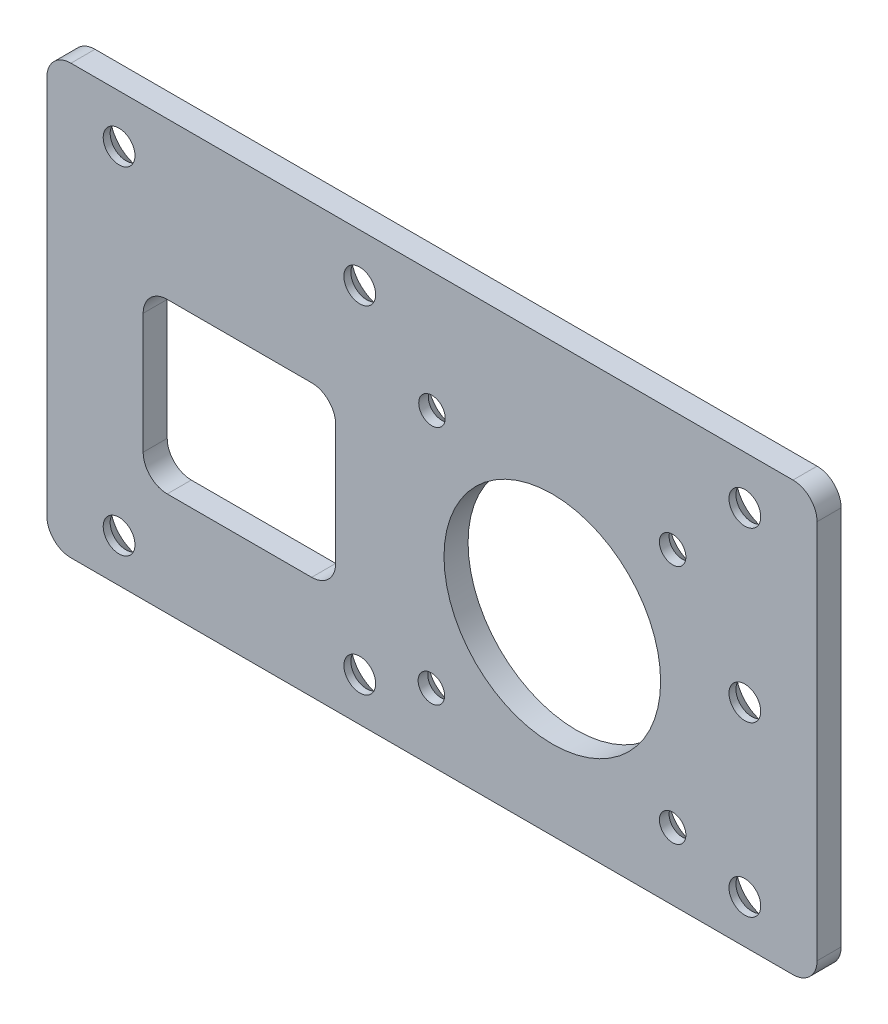
ISO-10303-21;
HEADER;
FILE_DESCRIPTION(('STEP AP214'),'2;1');
FILE_NAME('part.step','',(''),(''),'','','');
FILE_SCHEMA(('AUTOMOTIVE_DESIGN { 1 0 10303 214 1 1 1 1 }'));
ENDSEC;
DATA;
#1=APPLICATION_CONTEXT('core data for automotive mechanical design processes');
#2=APPLICATION_PROTOCOL_DEFINITION('international standard','automotive_design',2000,#1);
#3=PRODUCT_CONTEXT('',#1,'mechanical');
#4=PRODUCT('Part','Part','',(#3));
#5=PRODUCT_RELATED_PRODUCT_CATEGORY('part','',(#4));
#6=PRODUCT_DEFINITION_FORMATION('','',#4);
#7=PRODUCT_DEFINITION_CONTEXT('part definition',#1,'design');
#8=PRODUCT_DEFINITION('design','',#6,#7);
#9=PRODUCT_DEFINITION_SHAPE('','',#8);
#10=(LENGTH_UNIT() NAMED_UNIT(*) SI_UNIT(.MILLI.,.METRE.));
#11=(NAMED_UNIT(*) PLANE_ANGLE_UNIT() SI_UNIT($,.RADIAN.));
#12=(NAMED_UNIT(*) SI_UNIT($,.STERADIAN.) SOLID_ANGLE_UNIT());
#13=UNCERTAINTY_MEASURE_WITH_UNIT(LENGTH_MEASURE(1.E-05),#10,'distance_accuracy_value','');
#14=(GEOMETRIC_REPRESENTATION_CONTEXT(3) GLOBAL_UNCERTAINTY_ASSIGNED_CONTEXT((#13)) GLOBAL_UNIT_ASSIGNED_CONTEXT((#10,
#11,#12)) REPRESENTATION_CONTEXT('',''));
#15=CARTESIAN_POINT('',(0.,0.,0.));
#16=DIRECTION('',(0.,0.,1.));
#17=DIRECTION('',(1.,0.,0.));
#18=AXIS2_PLACEMENT_3D('',#15,#16,#17);
#19=CARTESIAN_POINT('',(55.,-39.,5.));
#20=DIRECTION('',(-1.,0.,0.));
#21=DIRECTION('',(0.,-1.,0.));
#22=AXIS2_PLACEMENT_3D('',#19,#20,#21);
#23=PLANE('',#22);
#24=DIRECTION('',(0.,1.,0.));
#25=VECTOR('',#24,1.);
#26=CARTESIAN_POINT('',(55.,-39.,5.));
#27=LINE('',#26,#25);
#28=CARTESIAN_POINT('',(55.,-34.,5.));
#29=VERTEX_POINT('',#28);
#30=CARTESIAN_POINT('',(55.,45.,5.));
#31=VERTEX_POINT('',#30);
#32=EDGE_CURVE('E312',#29,#31,#27,.T.);
#33=ORIENTED_EDGE('',*,*,#32,.F.);
#34=DIRECTION('',(0.,0.,-1.));
#35=VECTOR('',#34,1.);
#36=CARTESIAN_POINT('',(55.,-34.,5.));
#37=LINE('',#36,#35);
#38=CARTESIAN_POINT('',(55.,-34.,0.));
#39=VERTEX_POINT('',#38);
#40=EDGE_CURVE('E172',#29,#39,#37,.T.);
#41=ORIENTED_EDGE('',*,*,#40,.T.);
#42=DIRECTION('',(0.,1.,0.));
#43=VECTOR('',#42,1.);
#44=CARTESIAN_POINT('',(55.,-39.,0.));
#45=LINE('',#44,#43);
#46=CARTESIAN_POINT('',(55.,45.,0.));
#47=VERTEX_POINT('',#46);
#48=EDGE_CURVE('E323',#39,#47,#45,.T.);
#49=ORIENTED_EDGE('',*,*,#48,.T.);
#50=DIRECTION('',(0.,0.,-1.));
#51=VECTOR('',#50,1.);
#52=CARTESIAN_POINT('',(55.,45.,5.));
#53=LINE('',#52,#51);
#54=EDGE_CURVE('E378',#47,#31,#53,.F.);
#55=ORIENTED_EDGE('',*,*,#54,.T.);
#56=EDGE_LOOP('',(#33,#41,#49,#55));
#57=FACE_BOUND('',#56,.T.);
#58=ADVANCED_FACE('F47',(#57),#23,.F.);
#59=CARTESIAN_POINT('',(-105.,50.0000000000005,5.));
#60=DIRECTION('',(0.,-1.,0.));
#61=DIRECTION('',(1.,0.,0.));
#62=AXIS2_PLACEMENT_3D('',#59,#60,#61);
#63=PLANE('',#62);
#64=DIRECTION('',(-1.,0.,0.));
#65=VECTOR('',#64,1.);
#66=CARTESIAN_POINT('',(-105.,50.0000000000005,0.));
#67=LINE('',#66,#65);
#68=CARTESIAN_POINT('',(50.,50.,0.));
#69=VERTEX_POINT('',#68);
#70=CARTESIAN_POINT('',(-100.,50.0000000000005,0.));
#71=VERTEX_POINT('',#70);
#72=EDGE_CURVE('E326',#69,#71,#67,.T.);
#73=ORIENTED_EDGE('',*,*,#72,.T.);
#74=DIRECTION('',(0.,0.,-1.));
#75=VECTOR('',#74,1.);
#76=CARTESIAN_POINT('',(-100.,50.0000000000005,5.));
#77=LINE('',#76,#75);
#78=CARTESIAN_POINT('',(-100.,50.0000000000005,5.));
#79=VERTEX_POINT('',#78);
#80=EDGE_CURVE('E62',#71,#79,#77,.F.);
#81=ORIENTED_EDGE('',*,*,#80,.T.);
#82=DIRECTION('',(-1.,0.,0.));
#83=VECTOR('',#82,1.);
#84=CARTESIAN_POINT('',(-105.,50.0000000000005,5.));
#85=LINE('',#84,#83);
#86=CARTESIAN_POINT('',(50.,50.,5.));
#87=VERTEX_POINT('',#86);
#88=EDGE_CURVE('E314',#87,#79,#85,.T.);
#89=ORIENTED_EDGE('',*,*,#88,.F.);
#90=DIRECTION('',(0.,0.,-1.));
#91=VECTOR('',#90,1.);
#92=CARTESIAN_POINT('',(50.,50.,5.));
#93=LINE('',#92,#91);
#94=EDGE_CURVE('E374',#87,#69,#93,.T.);
#95=ORIENTED_EDGE('',*,*,#94,.T.);
#96=EDGE_LOOP('',(#73,#81,#89,#95));
#97=FACE_BOUND('',#96,.T.);
#98=ADVANCED_FACE('F424',(#97),#63,.F.);
#99=CARTESIAN_POINT('',(-105.,-39.,5.));
#100=DIRECTION('',(1.,0.,0.));
#101=DIRECTION('',(0.,0.,-1.));
#102=AXIS2_PLACEMENT_3D('',#99,#100,#101);
#103=PLANE('',#102);
#104=DIRECTION('',(0.,-1.,0.));
#105=VECTOR('',#104,1.);
#106=CARTESIAN_POINT('',(-105.,-39.,0.));
#107=LINE('',#106,#105);
#108=CARTESIAN_POINT('',(-105.,45.0000000000005,0.));
#109=VERTEX_POINT('',#108);
#110=CARTESIAN_POINT('',(-105.,-34.,0.));
#111=VERTEX_POINT('',#110);
#112=EDGE_CURVE('E328',#109,#111,#107,.T.);
#113=ORIENTED_EDGE('',*,*,#112,.T.);
#114=DIRECTION('',(0.,0.,-1.));
#115=VECTOR('',#114,1.);
#116=CARTESIAN_POINT('',(-105.,-34.,5.));
#117=LINE('',#116,#115);
#118=CARTESIAN_POINT('',(-105.,-34.,5.));
#119=VERTEX_POINT('',#118);
#120=EDGE_CURVE('E365',#111,#119,#117,.F.);
#121=ORIENTED_EDGE('',*,*,#120,.T.);
#122=DIRECTION('',(0.,-1.,0.));
#123=VECTOR('',#122,1.);
#124=CARTESIAN_POINT('',(-105.,-39.,5.));
#125=LINE('',#124,#123);
#126=CARTESIAN_POINT('',(-105.,45.0000000000005,5.));
#127=VERTEX_POINT('',#126);
#128=EDGE_CURVE('E317',#127,#119,#125,.T.);
#129=ORIENTED_EDGE('',*,*,#128,.F.);
#130=DIRECTION('',(0.,0.,-1.));
#131=VECTOR('',#130,1.);
#132=CARTESIAN_POINT('',(-105.,45.0000000000005,5.));
#133=LINE('',#132,#131);
#134=EDGE_CURVE('E362',#127,#109,#133,.T.);
#135=ORIENTED_EDGE('',*,*,#134,.T.);
#136=EDGE_LOOP('',(#113,#121,#129,#135));
#137=FACE_BOUND('',#136,.T.);
#138=ADVANCED_FACE('F430',(#137),#103,.F.);
#139=CARTESIAN_POINT('',(-105.,-39.,5.));
#140=DIRECTION('',(0.,1.,0.));
#141=DIRECTION('',(0.,0.,1.));
#142=AXIS2_PLACEMENT_3D('',#139,#140,#141);
#143=PLANE('',#142);
#144=DIRECTION('',(1.,0.,0.));
#145=VECTOR('',#144,1.);
#146=CARTESIAN_POINT('',(-105.,-39.,5.));
#147=LINE('',#146,#145);
#148=CARTESIAN_POINT('',(-100.,-39.,5.));
#149=VERTEX_POINT('',#148);
#150=CARTESIAN_POINT('',(50.,-39.,5.));
#151=VERTEX_POINT('',#150);
#152=EDGE_CURVE('E320',#149,#151,#147,.T.);
#153=ORIENTED_EDGE('',*,*,#152,.F.);
#154=DIRECTION('',(0.,0.,-1.));
#155=VECTOR('',#154,1.);
#156=CARTESIAN_POINT('',(-100.,-39.,5.));
#157=LINE('',#156,#155);
#158=CARTESIAN_POINT('',(-100.,-39.,0.));
#159=VERTEX_POINT('',#158);
#160=EDGE_CURVE('E351',#149,#159,#157,.T.);
#161=ORIENTED_EDGE('',*,*,#160,.T.);
#162=DIRECTION('',(1.,0.,0.));
#163=VECTOR('',#162,1.);
#164=CARTESIAN_POINT('',(-105.,-39.,0.));
#165=LINE('',#164,#163);
#166=CARTESIAN_POINT('',(50.,-39.,0.));
#167=VERTEX_POINT('',#166);
#168=EDGE_CURVE('E315',#159,#167,#165,.T.);
#169=ORIENTED_EDGE('',*,*,#168,.T.);
#170=DIRECTION('',(0.,0.,-1.));
#171=VECTOR('',#170,1.);
#172=CARTESIAN_POINT('',(50.,-39.,5.));
#173=LINE('',#172,#171);
#174=EDGE_CURVE('E349',#167,#151,#173,.F.);
#175=ORIENTED_EDGE('',*,*,#174,.T.);
#176=EDGE_LOOP('',(#153,#161,#169,#175));
#177=FACE_BOUND('',#176,.T.);
#178=ADVANCED_FACE('F475',(#177),#143,.F.);
#179=CARTESIAN_POINT('',(0.,0.,5.));
#180=DIRECTION('',(0.,0.,-1.));
#181=DIRECTION('',(-1.,0.,0.));
#182=AXIS2_PLACEMENT_3D('',#179,#180,#181);
#183=PLANE('',#182);
#184=DIRECTION('',(0.,1.,0.));
#185=VECTOR('',#184,1.);
#186=CARTESIAN_POINT('',(-85.,0.,5.));
#187=LINE('',#186,#185);
#188=CARTESIAN_POINT('',(-85.,-12.5,5.));
#189=VERTEX_POINT('',#188);
#190=CARTESIAN_POINT('',(-85.,12.5,5.));
#191=VERTEX_POINT('',#190);
#192=EDGE_CURVE('E181',#189,#191,#187,.T.);
#193=ORIENTED_EDGE('',*,*,#192,.T.);
#194=CARTESIAN_POINT('',(-80.,12.5,5.));
#195=DIRECTION('',(0.,0.,-1.));
#196=DIRECTION('',(-1.,0.,0.));
#197=AXIS2_PLACEMENT_3D('',#194,#195,#196);
#198=CIRCLE('',#197,5.);
#199=CARTESIAN_POINT('',(-80.,17.5,5.));
#200=VERTEX_POINT('',#199);
#201=EDGE_CURVE('E384',#191,#200,#198,.T.);
#202=ORIENTED_EDGE('',*,*,#201,.T.);
#203=DIRECTION('',(1.,0.,0.));
#204=VECTOR('',#203,1.);
#205=CARTESIAN_POINT('',(0.,17.5,5.));
#206=LINE('',#205,#204);
#207=CARTESIAN_POINT('',(-50.,17.5,5.));
#208=VERTEX_POINT('',#207);
#209=EDGE_CURVE('E203',#200,#208,#206,.T.);
#210=ORIENTED_EDGE('',*,*,#209,.T.);
#211=CARTESIAN_POINT('',(-50.,12.5,5.));
#212=DIRECTION('',(0.,0.,-1.));
#213=DIRECTION('',(-1.,0.,0.));
#214=AXIS2_PLACEMENT_3D('',#211,#212,#213);
#215=CIRCLE('',#214,5.);
#216=CARTESIAN_POINT('',(-45.,12.5,5.));
#217=VERTEX_POINT('',#216);
#218=EDGE_CURVE('E11',#208,#217,#215,.T.);
#219=ORIENTED_EDGE('',*,*,#218,.T.);
#220=DIRECTION('',(0.,-1.,0.));
#221=VECTOR('',#220,1.);
#222=CARTESIAN_POINT('',(-45.,0.,5.));
#223=LINE('',#222,#221);
#224=CARTESIAN_POINT('',(-45.,-12.5,5.));
#225=VERTEX_POINT('',#224);
#226=EDGE_CURVE('E206',#217,#225,#223,.T.);
#227=ORIENTED_EDGE('',*,*,#226,.T.);
#228=CARTESIAN_POINT('',(-50.,-12.5,5.));
#229=DIRECTION('',(0.,0.,-1.));
#230=DIRECTION('',(-1.,0.,0.));
#231=AXIS2_PLACEMENT_3D('',#228,#229,#230);
#232=CIRCLE('',#231,5.);
#233=CARTESIAN_POINT('',(-50.,-17.5,5.));
#234=VERTEX_POINT('',#233);
#235=EDGE_CURVE('E388',#225,#234,#232,.T.);
#236=ORIENTED_EDGE('',*,*,#235,.T.);
#237=DIRECTION('',(-1.,0.,0.));
#238=VECTOR('',#237,1.);
#239=CARTESIAN_POINT('',(0.,-17.5,5.));
#240=LINE('',#239,#238);
#241=CARTESIAN_POINT('',(-80.,-17.5,5.));
#242=VERTEX_POINT('',#241);
#243=EDGE_CURVE('E194',#234,#242,#240,.T.);
#244=ORIENTED_EDGE('',*,*,#243,.T.);
#245=CARTESIAN_POINT('',(-80.,-12.5,5.));
#246=DIRECTION('',(0.,0.,-1.));
#247=DIRECTION('',(-1.,0.,0.));
#248=AXIS2_PLACEMENT_3D('',#245,#246,#247);
#249=CIRCLE('',#248,5.);
#250=EDGE_CURVE('E171',#242,#189,#249,.T.);
#251=ORIENTED_EDGE('',*,*,#250,.T.);
#252=EDGE_LOOP('',(#193,#202,#210,#219,#227,#236,#244,#251));
#253=FACE_BOUND('',#252,.T.);
#254=CARTESIAN_POINT('',(25.,25.,5.));
#255=DIRECTION('',(0.,0.,-1.));
#256=DIRECTION('',(-1.,0.,0.));
#257=AXIS2_PLACEMENT_3D('',#254,#255,#256);
#258=CIRCLE('',#257,2.75);
#259=CARTESIAN_POINT('',(22.25,25.,5.));
#260=VERTEX_POINT('',#259);
#261=EDGE_CURVE('E215',#260,#260,#258,.T.);
#262=ORIENTED_EDGE('',*,*,#261,.T.);
#263=EDGE_LOOP('',(#262));
#264=FACE_BOUND('',#263,.T.);
#265=CARTESIAN_POINT('',(25.,-25.,5.));
#266=DIRECTION('',(0.,0.,-1.));
#267=DIRECTION('',(-1.,0.,0.));
#268=AXIS2_PLACEMENT_3D('',#265,#266,#267);
#269=CIRCLE('',#268,2.75);
#270=CARTESIAN_POINT('',(22.25,-25.,5.));
#271=VERTEX_POINT('',#270);
#272=EDGE_CURVE('E224',#271,#271,#269,.T.);
#273=ORIENTED_EDGE('',*,*,#272,.T.);
#274=EDGE_LOOP('',(#273));
#275=FACE_BOUND('',#274,.T.);
#276=CARTESIAN_POINT('',(-25.1249454463221,-25.,5.));
#277=DIRECTION('',(0.,0.,-1.));
#278=DIRECTION('',(-1.,0.,0.));
#279=AXIS2_PLACEMENT_3D('',#276,#277,#278);
#280=CIRCLE('',#279,2.75);
#281=CARTESIAN_POINT('',(-27.8749454463221,-25.,5.));
#282=VERTEX_POINT('',#281);
#283=EDGE_CURVE('E233',#282,#282,#280,.T.);
#284=ORIENTED_EDGE('',*,*,#283,.T.);
#285=EDGE_LOOP('',(#284));
#286=FACE_BOUND('',#285,.T.);
#287=CARTESIAN_POINT('',(-25.,25.,5.));
#288=DIRECTION('',(0.,0.,-1.));
#289=DIRECTION('',(-1.,0.,0.));
#290=AXIS2_PLACEMENT_3D('',#287,#288,#289);
#291=CIRCLE('',#290,2.75);
#292=CARTESIAN_POINT('',(-27.75,25.,5.));
#293=VERTEX_POINT('',#292);
#294=EDGE_CURVE('E242',#293,#293,#291,.T.);
#295=ORIENTED_EDGE('',*,*,#294,.T.);
#296=EDGE_LOOP('',(#295));
#297=FACE_BOUND('',#296,.T.);
#298=CARTESIAN_POINT('',(40.,-30.,5.));
#299=DIRECTION('',(0.,0.,-1.));
#300=DIRECTION('',(-1.,0.,0.));
#301=AXIS2_PLACEMENT_3D('',#298,#299,#300);
#302=CIRCLE('',#301,3.3);
#303=CARTESIAN_POINT('',(36.7,-30.,5.));
#304=VERTEX_POINT('',#303);
#305=EDGE_CURVE('E251',#304,#304,#302,.T.);
#306=ORIENTED_EDGE('',*,*,#305,.T.);
#307=EDGE_LOOP('',(#306));
#308=FACE_BOUND('',#307,.T.);
#309=CARTESIAN_POINT('',(40.,4.99999999999999,5.));
#310=DIRECTION('',(0.,0.,-1.));
#311=DIRECTION('',(-1.,0.,0.));
#312=AXIS2_PLACEMENT_3D('',#309,#310,#311);
#313=CIRCLE('',#312,3.3);
#314=CARTESIAN_POINT('',(36.7,4.99999999999999,5.));
#315=VERTEX_POINT('',#314);
#316=EDGE_CURVE('E260',#315,#315,#313,.T.);
#317=ORIENTED_EDGE('',*,*,#316,.T.);
#318=EDGE_LOOP('',(#317));
#319=FACE_BOUND('',#318,.T.);
#320=CARTESIAN_POINT('',(40.,40.,5.));
#321=DIRECTION('',(0.,0.,-1.));
#322=DIRECTION('',(-1.,0.,0.));
#323=AXIS2_PLACEMENT_3D('',#320,#321,#322);
#324=CIRCLE('',#323,3.3);
#325=CARTESIAN_POINT('',(36.7,40.,5.));
#326=VERTEX_POINT('',#325);
#327=EDGE_CURVE('E269',#326,#326,#324,.T.);
#328=ORIENTED_EDGE('',*,*,#327,.T.);
#329=EDGE_LOOP('',(#328));
#330=FACE_BOUND('',#329,.T.);
#331=CARTESIAN_POINT('',(-40.,40.,5.));
#332=DIRECTION('',(0.,0.,-1.));
#333=DIRECTION('',(-1.,0.,0.));
#334=AXIS2_PLACEMENT_3D('',#331,#332,#333);
#335=CIRCLE('',#334,3.3);
#336=CARTESIAN_POINT('',(-43.3,40.,5.));
#337=VERTEX_POINT('',#336);
#338=EDGE_CURVE('E278',#337,#337,#335,.T.);
#339=ORIENTED_EDGE('',*,*,#338,.T.);
#340=EDGE_LOOP('',(#339));
#341=FACE_BOUND('',#340,.T.);
#342=CARTESIAN_POINT('',(-40.,-30.,5.));
#343=DIRECTION('',(0.,0.,-1.));
#344=DIRECTION('',(-1.,0.,0.));
#345=AXIS2_PLACEMENT_3D('',#342,#343,#344);
#346=CIRCLE('',#345,3.3);
#347=CARTESIAN_POINT('',(-43.3,-30.,5.));
#348=VERTEX_POINT('',#347);
#349=EDGE_CURVE('E287',#348,#348,#346,.T.);
#350=ORIENTED_EDGE('',*,*,#349,.T.);
#351=EDGE_LOOP('',(#350));
#352=FACE_BOUND('',#351,.T.);
#353=CARTESIAN_POINT('',(-90.,-30.,5.));
#354=DIRECTION('',(0.,0.,-1.));
#355=DIRECTION('',(-1.,0.,0.));
#356=AXIS2_PLACEMENT_3D('',#353,#354,#355);
#357=CIRCLE('',#356,3.3);
#358=CARTESIAN_POINT('',(-93.3,-30.,5.));
#359=VERTEX_POINT('',#358);
#360=EDGE_CURVE('E296',#359,#359,#357,.T.);
#361=ORIENTED_EDGE('',*,*,#360,.T.);
#362=EDGE_LOOP('',(#361));
#363=FACE_BOUND('',#362,.T.);
#364=CARTESIAN_POINT('',(-90.,40.,5.));
#365=DIRECTION('',(0.,0.,-1.));
#366=DIRECTION('',(-1.,0.,0.));
#367=AXIS2_PLACEMENT_3D('',#364,#365,#366);
#368=CIRCLE('',#367,3.3);
#369=CARTESIAN_POINT('',(-93.3,40.,5.));
#370=VERTEX_POINT('',#369);
#371=EDGE_CURVE('E305',#370,#370,#368,.T.);
#372=ORIENTED_EDGE('',*,*,#371,.T.);
#373=EDGE_LOOP('',(#372));
#374=FACE_BOUND('',#373,.T.);
#375=CARTESIAN_POINT('',(0.,0.,5.));
#376=DIRECTION('',(0.,0.,1.));
#377=DIRECTION('',(1.,0.,0.));
#378=AXIS2_PLACEMENT_3D('',#375,#376,#377);
#379=CIRCLE('',#378,22.5);
#380=CARTESIAN_POINT('',(22.5,0.,5.));
#381=VERTEX_POINT('',#380);
#382=EDGE_CURVE('E308',#381,#381,#379,.T.);
#383=ORIENTED_EDGE('',*,*,#382,.F.);
#384=EDGE_LOOP('',(#383));
#385=FACE_BOUND('',#384,.T.);
#386=ORIENTED_EDGE('',*,*,#128,.T.);
#387=CARTESIAN_POINT('',(-100.,-34.,5.));
#388=DIRECTION('',(0.,0.,-1.));
#389=DIRECTION('',(-1.,0.,0.));
#390=AXIS2_PLACEMENT_3D('',#387,#388,#389);
#391=CIRCLE('',#390,5.);
#392=EDGE_CURVE('E372',#119,#149,#391,.F.);
#393=ORIENTED_EDGE('',*,*,#392,.T.);
#394=ORIENTED_EDGE('',*,*,#152,.T.);
#395=CARTESIAN_POINT('',(50.,-34.,5.));
#396=DIRECTION('',(0.,0.,-1.));
#397=DIRECTION('',(-1.,0.,0.));
#398=AXIS2_PLACEMENT_3D('',#395,#396,#397);
#399=CIRCLE('',#398,5.);
#400=EDGE_CURVE('E368',#151,#29,#399,.F.);
#401=ORIENTED_EDGE('',*,*,#400,.T.);
#402=ORIENTED_EDGE('',*,*,#32,.T.);
#403=CARTESIAN_POINT('',(50.,45.,5.));
#404=DIRECTION('',(0.,0.,-1.));
#405=DIRECTION('',(-1.,0.,0.));
#406=AXIS2_PLACEMENT_3D('',#403,#404,#405);
#407=CIRCLE('',#406,5.);
#408=EDGE_CURVE('E69',#31,#87,#407,.F.);
#409=ORIENTED_EDGE('',*,*,#408,.T.);
#410=ORIENTED_EDGE('',*,*,#88,.T.);
#411=CARTESIAN_POINT('',(-100.,45.0000000000005,5.));
#412=DIRECTION('',(0.,0.,-1.));
#413=DIRECTION('',(-1.,0.,0.));
#414=AXIS2_PLACEMENT_3D('',#411,#412,#413);
#415=CIRCLE('',#414,5.);
#416=EDGE_CURVE('E370',#79,#127,#415,.F.);
#417=ORIENTED_EDGE('',*,*,#416,.T.);
#418=EDGE_LOOP('',(#386,#393,#394,#401,#402,#409,#410,#417));
#419=FACE_BOUND('',#418,.T.);
#420=ADVANCED_FACE('F401',(#253,#264,#275,#286,#297,#308,#319,#330,#341,#352,#363,#374,#385,
#419),#183,.F.);
#421=CARTESIAN_POINT('',(0.,0.,0.));
#422=DIRECTION('',(0.,0.,-1.));
#423=DIRECTION('',(-1.,0.,0.));
#424=AXIS2_PLACEMENT_3D('',#421,#422,#423);
#425=PLANE('',#424);
#426=DIRECTION('',(0.,-1.,0.));
#427=VECTOR('',#426,1.);
#428=CARTESIAN_POINT('',(-45.,-17.5,0.));
#429=LINE('',#428,#427);
#430=CARTESIAN_POINT('',(-45.,12.5,0.));
#431=VERTEX_POINT('',#430);
#432=CARTESIAN_POINT('',(-45.,-12.5,0.));
#433=VERTEX_POINT('',#432);
#434=EDGE_CURVE('E196',#431,#433,#429,.T.);
#435=ORIENTED_EDGE('',*,*,#434,.F.);
#436=CARTESIAN_POINT('',(-50.,12.5,0.));
#437=DIRECTION('',(0.,0.,-1.));
#438=DIRECTION('',(-1.,0.,0.));
#439=AXIS2_PLACEMENT_3D('',#436,#437,#438);
#440=CIRCLE('',#439,5.);
#441=CARTESIAN_POINT('',(-50.,17.5,0.));
#442=VERTEX_POINT('',#441);
#443=EDGE_CURVE('E55',#431,#442,#440,.F.);
#444=ORIENTED_EDGE('',*,*,#443,.T.);
#445=DIRECTION('',(1.,0.,0.));
#446=VECTOR('',#445,1.);
#447=CARTESIAN_POINT('',(-85.,17.5,0.));
#448=LINE('',#447,#446);
#449=CARTESIAN_POINT('',(-80.,17.5,0.));
#450=VERTEX_POINT('',#449);
#451=EDGE_CURVE('E190',#450,#442,#448,.T.);
#452=ORIENTED_EDGE('',*,*,#451,.F.);
#453=CARTESIAN_POINT('',(-80.,12.5,0.));
#454=DIRECTION('',(0.,0.,-1.));
#455=DIRECTION('',(-1.,0.,0.));
#456=AXIS2_PLACEMENT_3D('',#453,#454,#455);
#457=CIRCLE('',#456,5.);
#458=CARTESIAN_POINT('',(-85.,12.5,0.));
#459=VERTEX_POINT('',#458);
#460=EDGE_CURVE('E189',#450,#459,#457,.F.);
#461=ORIENTED_EDGE('',*,*,#460,.T.);
#462=DIRECTION('',(0.,1.,0.));
#463=VECTOR('',#462,1.);
#464=CARTESIAN_POINT('',(-85.,-17.5,0.));
#465=LINE('',#464,#463);
#466=CARTESIAN_POINT('',(-85.,-12.5,0.));
#467=VERTEX_POINT('',#466);
#468=EDGE_CURVE('E178',#467,#459,#465,.T.);
#469=ORIENTED_EDGE('',*,*,#468,.F.);
#470=CARTESIAN_POINT('',(-80.,-12.5,0.));
#471=DIRECTION('',(0.,0.,-1.));
#472=DIRECTION('',(-1.,0.,0.));
#473=AXIS2_PLACEMENT_3D('',#470,#471,#472);
#474=CIRCLE('',#473,5.);
#475=CARTESIAN_POINT('',(-80.,-17.5,0.));
#476=VERTEX_POINT('',#475);
#477=EDGE_CURVE('E161',#467,#476,#474,.F.);
#478=ORIENTED_EDGE('',*,*,#477,.T.);
#479=DIRECTION('',(-1.,0.,0.));
#480=VECTOR('',#479,1.);
#481=CARTESIAN_POINT('',(-85.,-17.5,0.));
#482=LINE('',#481,#480);
#483=CARTESIAN_POINT('',(-50.,-17.5,0.));
#484=VERTEX_POINT('',#483);
#485=EDGE_CURVE('E191',#484,#476,#482,.T.);
#486=ORIENTED_EDGE('',*,*,#485,.F.);
#487=CARTESIAN_POINT('',(-50.,-12.5,0.));
#488=DIRECTION('',(0.,0.,-1.));
#489=DIRECTION('',(-1.,0.,0.));
#490=AXIS2_PLACEMENT_3D('',#487,#488,#489);
#491=CIRCLE('',#490,5.);
#492=EDGE_CURVE('E386',#484,#433,#491,.F.);
#493=ORIENTED_EDGE('',*,*,#492,.T.);
#494=EDGE_LOOP('',(#435,#444,#452,#461,#469,#478,#486,#493));
#495=FACE_BOUND('',#494,.T.);
#496=CARTESIAN_POINT('',(25.,25.,0.));
#497=DIRECTION('',(0.,0.,-1.));
#498=DIRECTION('',(-1.,0.,0.));
#499=AXIS2_PLACEMENT_3D('',#496,#497,#498);
#500=CIRCLE('',#499,5.735);
#501=CARTESIAN_POINT('',(19.265,25.,0.));
#502=VERTEX_POINT('',#501);
#503=EDGE_CURVE('E209',#502,#502,#500,.T.);
#504=ORIENTED_EDGE('',*,*,#503,.F.);
#505=EDGE_LOOP('',(#504));
#506=FACE_BOUND('',#505,.T.);
#507=CARTESIAN_POINT('',(25.,-25.,0.));
#508=DIRECTION('',(0.,0.,-1.));
#509=DIRECTION('',(-1.,0.,0.));
#510=AXIS2_PLACEMENT_3D('',#507,#508,#509);
#511=CIRCLE('',#510,5.735);
#512=CARTESIAN_POINT('',(19.265,-25.,0.));
#513=VERTEX_POINT('',#512);
#514=EDGE_CURVE('E218',#513,#513,#511,.T.);
#515=ORIENTED_EDGE('',*,*,#514,.F.);
#516=EDGE_LOOP('',(#515));
#517=FACE_BOUND('',#516,.T.);
#518=CARTESIAN_POINT('',(-25.1249454463221,-25.,0.));
#519=DIRECTION('',(0.,0.,-1.));
#520=DIRECTION('',(-1.,0.,0.));
#521=AXIS2_PLACEMENT_3D('',#518,#519,#520);
#522=CIRCLE('',#521,5.735);
#523=CARTESIAN_POINT('',(-30.8599454463221,-25.,0.));
#524=VERTEX_POINT('',#523);
#525=EDGE_CURVE('E227',#524,#524,#522,.T.);
#526=ORIENTED_EDGE('',*,*,#525,.F.);
#527=EDGE_LOOP('',(#526));
#528=FACE_BOUND('',#527,.T.);
#529=CARTESIAN_POINT('',(-25.,25.,0.));
#530=DIRECTION('',(0.,0.,-1.));
#531=DIRECTION('',(-1.,0.,0.));
#532=AXIS2_PLACEMENT_3D('',#529,#530,#531);
#533=CIRCLE('',#532,5.735);
#534=CARTESIAN_POINT('',(-30.735,25.,0.));
#535=VERTEX_POINT('',#534);
#536=EDGE_CURVE('E236',#535,#535,#533,.T.);
#537=ORIENTED_EDGE('',*,*,#536,.F.);
#538=EDGE_LOOP('',(#537));
#539=FACE_BOUND('',#538,.T.);
#540=CARTESIAN_POINT('',(40.,-30.,0.));
#541=DIRECTION('',(0.,0.,-1.));
#542=DIRECTION('',(-1.,0.,0.));
#543=AXIS2_PLACEMENT_3D('',#540,#541,#542);
#544=CIRCLE('',#543,6.855);
#545=CARTESIAN_POINT('',(33.145,-30.,0.));
#546=VERTEX_POINT('',#545);
#547=EDGE_CURVE('E245',#546,#546,#544,.T.);
#548=ORIENTED_EDGE('',*,*,#547,.F.);
#549=EDGE_LOOP('',(#548));
#550=FACE_BOUND('',#549,.T.);
#551=CARTESIAN_POINT('',(40.,4.99999999999999,0.));
#552=DIRECTION('',(0.,0.,-1.));
#553=DIRECTION('',(-1.,0.,0.));
#554=AXIS2_PLACEMENT_3D('',#551,#552,#553);
#555=CIRCLE('',#554,6.855);
#556=CARTESIAN_POINT('',(33.145,4.99999999999999,0.));
#557=VERTEX_POINT('',#556);
#558=EDGE_CURVE('E254',#557,#557,#555,.T.);
#559=ORIENTED_EDGE('',*,*,#558,.F.);
#560=EDGE_LOOP('',(#559));
#561=FACE_BOUND('',#560,.T.);
#562=CARTESIAN_POINT('',(40.,40.,0.));
#563=DIRECTION('',(0.,0.,-1.));
#564=DIRECTION('',(-1.,0.,0.));
#565=AXIS2_PLACEMENT_3D('',#562,#563,#564);
#566=CIRCLE('',#565,6.855);
#567=CARTESIAN_POINT('',(33.145,40.,0.));
#568=VERTEX_POINT('',#567);
#569=EDGE_CURVE('E263',#568,#568,#566,.T.);
#570=ORIENTED_EDGE('',*,*,#569,.F.);
#571=EDGE_LOOP('',(#570));
#572=FACE_BOUND('',#571,.T.);
#573=CARTESIAN_POINT('',(-40.,40.,0.));
#574=DIRECTION('',(0.,0.,-1.));
#575=DIRECTION('',(-1.,0.,0.));
#576=AXIS2_PLACEMENT_3D('',#573,#574,#575);
#577=CIRCLE('',#576,6.855);
#578=CARTESIAN_POINT('',(-46.855,40.,0.));
#579=VERTEX_POINT('',#578);
#580=EDGE_CURVE('E272',#579,#579,#577,.T.);
#581=ORIENTED_EDGE('',*,*,#580,.F.);
#582=EDGE_LOOP('',(#581));
#583=FACE_BOUND('',#582,.T.);
#584=CARTESIAN_POINT('',(-40.,-30.,0.));
#585=DIRECTION('',(0.,0.,-1.));
#586=DIRECTION('',(-1.,0.,0.));
#587=AXIS2_PLACEMENT_3D('',#584,#585,#586);
#588=CIRCLE('',#587,6.855);
#589=CARTESIAN_POINT('',(-46.855,-30.,0.));
#590=VERTEX_POINT('',#589);
#591=EDGE_CURVE('E281',#590,#590,#588,.T.);
#592=ORIENTED_EDGE('',*,*,#591,.F.);
#593=EDGE_LOOP('',(#592));
#594=FACE_BOUND('',#593,.T.);
#595=CARTESIAN_POINT('',(-90.,-30.,0.));
#596=DIRECTION('',(0.,0.,-1.));
#597=DIRECTION('',(-1.,0.,0.));
#598=AXIS2_PLACEMENT_3D('',#595,#596,#597);
#599=CIRCLE('',#598,6.855);
#600=CARTESIAN_POINT('',(-96.855,-30.,0.));
#601=VERTEX_POINT('',#600);
#602=EDGE_CURVE('E290',#601,#601,#599,.T.);
#603=ORIENTED_EDGE('',*,*,#602,.F.);
#604=EDGE_LOOP('',(#603));
#605=FACE_BOUND('',#604,.T.);
#606=CARTESIAN_POINT('',(-90.,40.,0.));
#607=DIRECTION('',(0.,0.,-1.));
#608=DIRECTION('',(-1.,0.,0.));
#609=AXIS2_PLACEMENT_3D('',#606,#607,#608);
#610=CIRCLE('',#609,6.855);
#611=CARTESIAN_POINT('',(-96.855,40.,0.));
#612=VERTEX_POINT('',#611);
#613=EDGE_CURVE('E299',#612,#612,#610,.T.);
#614=ORIENTED_EDGE('',*,*,#613,.F.);
#615=EDGE_LOOP('',(#614));
#616=FACE_BOUND('',#615,.T.);
#617=CARTESIAN_POINT('',(0.,0.,0.));
#618=DIRECTION('',(0.,0.,-1.));
#619=DIRECTION('',(-1.,0.,0.));
#620=AXIS2_PLACEMENT_3D('',#617,#618,#619);
#621=CIRCLE('',#620,22.5);
#622=CARTESIAN_POINT('',(-22.5,0.,0.));
#623=VERTEX_POINT('',#622);
#624=EDGE_CURVE('E311',#623,#623,#621,.T.);
#625=ORIENTED_EDGE('',*,*,#624,.F.);
#626=EDGE_LOOP('',(#625));
#627=FACE_BOUND('',#626,.T.);
#628=ORIENTED_EDGE('',*,*,#168,.F.);
#629=CARTESIAN_POINT('',(-100.,-34.,0.));
#630=DIRECTION('',(0.,0.,-1.));
#631=DIRECTION('',(-1.,0.,0.));
#632=AXIS2_PLACEMENT_3D('',#629,#630,#631);
#633=CIRCLE('',#632,5.);
#634=EDGE_CURVE('E360',#159,#111,#633,.T.);
#635=ORIENTED_EDGE('',*,*,#634,.T.);
#636=ORIENTED_EDGE('',*,*,#112,.F.);
#637=CARTESIAN_POINT('',(-100.,45.0000000000005,0.));
#638=DIRECTION('',(0.,0.,-1.));
#639=DIRECTION('',(-1.,0.,0.));
#640=AXIS2_PLACEMENT_3D('',#637,#638,#639);
#641=CIRCLE('',#640,5.);
#642=EDGE_CURVE('E358',#109,#71,#641,.T.);
#643=ORIENTED_EDGE('',*,*,#642,.T.);
#644=ORIENTED_EDGE('',*,*,#72,.F.);
#645=CARTESIAN_POINT('',(50.,45.,0.));
#646=DIRECTION('',(0.,0.,-1.));
#647=DIRECTION('',(-1.,0.,0.));
#648=AXIS2_PLACEMENT_3D('',#645,#646,#647);
#649=CIRCLE('',#648,5.);
#650=EDGE_CURVE('E354',#69,#47,#649,.T.);
#651=ORIENTED_EDGE('',*,*,#650,.T.);
#652=ORIENTED_EDGE('',*,*,#48,.F.);
#653=CARTESIAN_POINT('',(50.,-34.,0.));
#654=DIRECTION('',(0.,0.,-1.));
#655=DIRECTION('',(-1.,0.,0.));
#656=AXIS2_PLACEMENT_3D('',#653,#654,#655);
#657=CIRCLE('',#656,5.);
#658=EDGE_CURVE('E356',#39,#167,#657,.T.);
#659=ORIENTED_EDGE('',*,*,#658,.T.);
#660=EDGE_LOOP('',(#628,#635,#636,#643,#644,#651,#652,#659));
#661=FACE_BOUND('',#660,.T.);
#662=ADVANCED_FACE('F186',(#495,#506,#517,#528,#539,#550,#561,#572,#583,#594,#605,#616,#627,
#661),#425,.T.);
#663=CARTESIAN_POINT('',(0.,0.,-5.));
#664=DIRECTION('',(0.,0.,1.));
#665=DIRECTION('',(1.,0.,0.));
#666=AXIS2_PLACEMENT_3D('',#663,#664,#665);
#667=CYLINDRICAL_SURFACE('',#666,22.5);
#668=ORIENTED_EDGE('',*,*,#624,.T.);
#669=EDGE_LOOP('',(#668));
#670=FACE_BOUND('',#669,.T.);
#671=ORIENTED_EDGE('',*,*,#382,.T.);
#672=EDGE_LOOP('',(#671));
#673=FACE_BOUND('',#672,.T.);
#674=ADVANCED_FACE('F485',(#670,#673),#667,.F.);
#675=CARTESIAN_POINT('',(-90.,40.,0.));
#676=DIRECTION('',(0.,0.,-1.));
#677=DIRECTION('',(-1.,0.,0.));
#678=AXIS2_PLACEMENT_3D('',#675,#676,#677);
#679=CYLINDRICAL_SURFACE('',#678,3.3);
#680=ORIENTED_EDGE('',*,*,#371,.F.);
#681=EDGE_LOOP('',(#680));
#682=FACE_BOUND('',#681,.T.);
#683=CARTESIAN_POINT('',(-90.,40.,3.555));
#684=DIRECTION('',(0.,0.,-1.));
#685=DIRECTION('',(-1.,0.,0.));
#686=AXIS2_PLACEMENT_3D('',#683,#684,#685);
#687=CIRCLE('',#686,3.3);
#688=CARTESIAN_POINT('',(-93.3,40.,3.555));
#689=VERTEX_POINT('',#688);
#690=EDGE_CURVE('E302',#689,#689,#687,.T.);
#691=ORIENTED_EDGE('',*,*,#690,.T.);
#692=EDGE_LOOP('',(#691));
#693=FACE_BOUND('',#692,.T.);
#694=ADVANCED_FACE('F489',(#682,#693),#679,.F.);
#695=CARTESIAN_POINT('',(-90.,40.,0.));
#696=DIRECTION('',(0.,0.,-1.));
#697=DIRECTION('',(-1.,0.,0.));
#698=AXIS2_PLACEMENT_3D('',#695,#696,#697);
#699=CONICAL_SURFACE('',#698,6.855,0.785398163397448);
#700=ORIENTED_EDGE('',*,*,#690,.F.);
#701=EDGE_LOOP('',(#700));
#702=FACE_BOUND('',#701,.T.);
#703=ORIENTED_EDGE('',*,*,#613,.T.);
#704=EDGE_LOOP('',(#703));
#705=FACE_BOUND('',#704,.T.);
#706=ADVANCED_FACE('F493',(#702,#705),#699,.F.);
#707=CARTESIAN_POINT('',(-90.,-30.,0.));
#708=DIRECTION('',(0.,0.,-1.));
#709=DIRECTION('',(-1.,0.,0.));
#710=AXIS2_PLACEMENT_3D('',#707,#708,#709);
#711=CYLINDRICAL_SURFACE('',#710,3.3);
#712=ORIENTED_EDGE('',*,*,#360,.F.);
#713=EDGE_LOOP('',(#712));
#714=FACE_BOUND('',#713,.T.);
#715=CARTESIAN_POINT('',(-90.,-30.,3.555));
#716=DIRECTION('',(0.,0.,-1.));
#717=DIRECTION('',(-1.,0.,0.));
#718=AXIS2_PLACEMENT_3D('',#715,#716,#717);
#719=CIRCLE('',#718,3.3);
#720=CARTESIAN_POINT('',(-93.3,-30.,3.555));
#721=VERTEX_POINT('',#720);
#722=EDGE_CURVE('E293',#721,#721,#719,.T.);
#723=ORIENTED_EDGE('',*,*,#722,.T.);
#724=EDGE_LOOP('',(#723));
#725=FACE_BOUND('',#724,.T.);
#726=ADVANCED_FACE('F497',(#714,#725),#711,.F.);
#727=CARTESIAN_POINT('',(-90.,-30.,0.));
#728=DIRECTION('',(0.,0.,-1.));
#729=DIRECTION('',(-1.,0.,0.));
#730=AXIS2_PLACEMENT_3D('',#727,#728,#729);
#731=CONICAL_SURFACE('',#730,6.855,0.785398163397448);
#732=ORIENTED_EDGE('',*,*,#722,.F.);
#733=EDGE_LOOP('',(#732));
#734=FACE_BOUND('',#733,.T.);
#735=ORIENTED_EDGE('',*,*,#602,.T.);
#736=EDGE_LOOP('',(#735));
#737=FACE_BOUND('',#736,.T.);
#738=ADVANCED_FACE('F501',(#734,#737),#731,.F.);
#739=CARTESIAN_POINT('',(-40.,-30.,0.));
#740=DIRECTION('',(0.,0.,-1.));
#741=DIRECTION('',(-1.,0.,0.));
#742=AXIS2_PLACEMENT_3D('',#739,#740,#741);
#743=CYLINDRICAL_SURFACE('',#742,3.3);
#744=ORIENTED_EDGE('',*,*,#349,.F.);
#745=EDGE_LOOP('',(#744));
#746=FACE_BOUND('',#745,.T.);
#747=CARTESIAN_POINT('',(-40.,-30.,3.555));
#748=DIRECTION('',(0.,0.,-1.));
#749=DIRECTION('',(-1.,0.,0.));
#750=AXIS2_PLACEMENT_3D('',#747,#748,#749);
#751=CIRCLE('',#750,3.3);
#752=CARTESIAN_POINT('',(-43.3,-30.,3.555));
#753=VERTEX_POINT('',#752);
#754=EDGE_CURVE('E284',#753,#753,#751,.T.);
#755=ORIENTED_EDGE('',*,*,#754,.T.);
#756=EDGE_LOOP('',(#755));
#757=FACE_BOUND('',#756,.T.);
#758=ADVANCED_FACE('F505',(#746,#757),#743,.F.);
#759=CARTESIAN_POINT('',(-40.,-30.,0.));
#760=DIRECTION('',(0.,0.,-1.));
#761=DIRECTION('',(-1.,0.,0.));
#762=AXIS2_PLACEMENT_3D('',#759,#760,#761);
#763=CONICAL_SURFACE('',#762,6.855,0.785398163397448);
#764=ORIENTED_EDGE('',*,*,#754,.F.);
#765=EDGE_LOOP('',(#764));
#766=FACE_BOUND('',#765,.T.);
#767=ORIENTED_EDGE('',*,*,#591,.T.);
#768=EDGE_LOOP('',(#767));
#769=FACE_BOUND('',#768,.T.);
#770=ADVANCED_FACE('F509',(#766,#769),#763,.F.);
#771=CARTESIAN_POINT('',(-40.,40.,0.));
#772=DIRECTION('',(0.,0.,-1.));
#773=DIRECTION('',(-1.,0.,0.));
#774=AXIS2_PLACEMENT_3D('',#771,#772,#773);
#775=CYLINDRICAL_SURFACE('',#774,3.3);
#776=ORIENTED_EDGE('',*,*,#338,.F.);
#777=EDGE_LOOP('',(#776));
#778=FACE_BOUND('',#777,.T.);
#779=CARTESIAN_POINT('',(-40.,40.,3.555));
#780=DIRECTION('',(0.,0.,-1.));
#781=DIRECTION('',(-1.,0.,0.));
#782=AXIS2_PLACEMENT_3D('',#779,#780,#781);
#783=CIRCLE('',#782,3.3);
#784=CARTESIAN_POINT('',(-43.3,40.,3.555));
#785=VERTEX_POINT('',#784);
#786=EDGE_CURVE('E275',#785,#785,#783,.T.);
#787=ORIENTED_EDGE('',*,*,#786,.T.);
#788=EDGE_LOOP('',(#787));
#789=FACE_BOUND('',#788,.T.);
#790=ADVANCED_FACE('F513',(#778,#789),#775,.F.);
#791=CARTESIAN_POINT('',(-40.,40.,0.));
#792=DIRECTION('',(0.,0.,-1.));
#793=DIRECTION('',(-1.,0.,0.));
#794=AXIS2_PLACEMENT_3D('',#791,#792,#793);
#795=CONICAL_SURFACE('',#794,6.855,0.785398163397448);
#796=ORIENTED_EDGE('',*,*,#786,.F.);
#797=EDGE_LOOP('',(#796));
#798=FACE_BOUND('',#797,.T.);
#799=ORIENTED_EDGE('',*,*,#580,.T.);
#800=EDGE_LOOP('',(#799));
#801=FACE_BOUND('',#800,.T.);
#802=ADVANCED_FACE('F517',(#798,#801),#795,.F.);
#803=CARTESIAN_POINT('',(40.,40.,0.));
#804=DIRECTION('',(0.,0.,-1.));
#805=DIRECTION('',(-1.,0.,0.));
#806=AXIS2_PLACEMENT_3D('',#803,#804,#805);
#807=CYLINDRICAL_SURFACE('',#806,3.3);
#808=ORIENTED_EDGE('',*,*,#327,.F.);
#809=EDGE_LOOP('',(#808));
#810=FACE_BOUND('',#809,.T.);
#811=CARTESIAN_POINT('',(40.,40.,3.555));
#812=DIRECTION('',(0.,0.,-1.));
#813=DIRECTION('',(-1.,0.,0.));
#814=AXIS2_PLACEMENT_3D('',#811,#812,#813);
#815=CIRCLE('',#814,3.3);
#816=CARTESIAN_POINT('',(36.7,40.,3.555));
#817=VERTEX_POINT('',#816);
#818=EDGE_CURVE('E266',#817,#817,#815,.T.);
#819=ORIENTED_EDGE('',*,*,#818,.T.);
#820=EDGE_LOOP('',(#819));
#821=FACE_BOUND('',#820,.T.);
#822=ADVANCED_FACE('F521',(#810,#821),#807,.F.);
#823=CARTESIAN_POINT('',(40.,40.,0.));
#824=DIRECTION('',(0.,0.,-1.));
#825=DIRECTION('',(-1.,0.,0.));
#826=AXIS2_PLACEMENT_3D('',#823,#824,#825);
#827=CONICAL_SURFACE('',#826,6.855,0.785398163397448);
#828=ORIENTED_EDGE('',*,*,#818,.F.);
#829=EDGE_LOOP('',(#828));
#830=FACE_BOUND('',#829,.T.);
#831=ORIENTED_EDGE('',*,*,#569,.T.);
#832=EDGE_LOOP('',(#831));
#833=FACE_BOUND('',#832,.T.);
#834=ADVANCED_FACE('F525',(#830,#833),#827,.F.);
#835=CARTESIAN_POINT('',(40.,4.99999999999999,0.));
#836=DIRECTION('',(0.,0.,-1.));
#837=DIRECTION('',(-1.,0.,0.));
#838=AXIS2_PLACEMENT_3D('',#835,#836,#837);
#839=CYLINDRICAL_SURFACE('',#838,3.3);
#840=ORIENTED_EDGE('',*,*,#316,.F.);
#841=EDGE_LOOP('',(#840));
#842=FACE_BOUND('',#841,.T.);
#843=CARTESIAN_POINT('',(40.,4.99999999999999,3.555));
#844=DIRECTION('',(0.,0.,-1.));
#845=DIRECTION('',(-1.,0.,0.));
#846=AXIS2_PLACEMENT_3D('',#843,#844,#845);
#847=CIRCLE('',#846,3.3);
#848=CARTESIAN_POINT('',(36.7,4.99999999999999,3.555));
#849=VERTEX_POINT('',#848);
#850=EDGE_CURVE('E257',#849,#849,#847,.T.);
#851=ORIENTED_EDGE('',*,*,#850,.T.);
#852=EDGE_LOOP('',(#851));
#853=FACE_BOUND('',#852,.T.);
#854=ADVANCED_FACE('F529',(#842,#853),#839,.F.);
#855=CARTESIAN_POINT('',(40.,4.99999999999999,0.));
#856=DIRECTION('',(0.,0.,-1.));
#857=DIRECTION('',(-1.,0.,0.));
#858=AXIS2_PLACEMENT_3D('',#855,#856,#857);
#859=CONICAL_SURFACE('',#858,6.855,0.785398163397448);
#860=ORIENTED_EDGE('',*,*,#850,.F.);
#861=EDGE_LOOP('',(#860));
#862=FACE_BOUND('',#861,.T.);
#863=ORIENTED_EDGE('',*,*,#558,.T.);
#864=EDGE_LOOP('',(#863));
#865=FACE_BOUND('',#864,.T.);
#866=ADVANCED_FACE('F533',(#862,#865),#859,.F.);
#867=CARTESIAN_POINT('',(40.,-30.,0.));
#868=DIRECTION('',(0.,0.,-1.));
#869=DIRECTION('',(-1.,0.,0.));
#870=AXIS2_PLACEMENT_3D('',#867,#868,#869);
#871=CYLINDRICAL_SURFACE('',#870,3.3);
#872=ORIENTED_EDGE('',*,*,#305,.F.);
#873=EDGE_LOOP('',(#872));
#874=FACE_BOUND('',#873,.T.);
#875=CARTESIAN_POINT('',(40.,-30.,3.555));
#876=DIRECTION('',(0.,0.,-1.));
#877=DIRECTION('',(-1.,0.,0.));
#878=AXIS2_PLACEMENT_3D('',#875,#876,#877);
#879=CIRCLE('',#878,3.3);
#880=CARTESIAN_POINT('',(36.7,-30.,3.555));
#881=VERTEX_POINT('',#880);
#882=EDGE_CURVE('E248',#881,#881,#879,.T.);
#883=ORIENTED_EDGE('',*,*,#882,.T.);
#884=EDGE_LOOP('',(#883));
#885=FACE_BOUND('',#884,.T.);
#886=ADVANCED_FACE('F537',(#874,#885),#871,.F.);
#887=CARTESIAN_POINT('',(40.,-30.,0.));
#888=DIRECTION('',(0.,0.,-1.));
#889=DIRECTION('',(-1.,0.,0.));
#890=AXIS2_PLACEMENT_3D('',#887,#888,#889);
#891=CONICAL_SURFACE('',#890,6.855,0.785398163397448);
#892=ORIENTED_EDGE('',*,*,#882,.F.);
#893=EDGE_LOOP('',(#892));
#894=FACE_BOUND('',#893,.T.);
#895=ORIENTED_EDGE('',*,*,#547,.T.);
#896=EDGE_LOOP('',(#895));
#897=FACE_BOUND('',#896,.T.);
#898=ADVANCED_FACE('F541',(#894,#897),#891,.F.);
#899=CARTESIAN_POINT('',(-25.,25.,0.));
#900=DIRECTION('',(0.,0.,-1.));
#901=DIRECTION('',(-1.,0.,0.));
#902=AXIS2_PLACEMENT_3D('',#899,#900,#901);
#903=CYLINDRICAL_SURFACE('',#902,2.75);
#904=ORIENTED_EDGE('',*,*,#294,.F.);
#905=EDGE_LOOP('',(#904));
#906=FACE_BOUND('',#905,.T.);
#907=CARTESIAN_POINT('',(-25.,25.,2.985));
#908=DIRECTION('',(0.,0.,-1.));
#909=DIRECTION('',(-1.,0.,0.));
#910=AXIS2_PLACEMENT_3D('',#907,#908,#909);
#911=CIRCLE('',#910,2.75);
#912=CARTESIAN_POINT('',(-27.75,25.,2.985));
#913=VERTEX_POINT('',#912);
#914=EDGE_CURVE('E239',#913,#913,#911,.T.);
#915=ORIENTED_EDGE('',*,*,#914,.T.);
#916=EDGE_LOOP('',(#915));
#917=FACE_BOUND('',#916,.T.);
#918=ADVANCED_FACE('F545',(#906,#917),#903,.F.);
#919=CARTESIAN_POINT('',(-25.,25.,0.));
#920=DIRECTION('',(0.,0.,-1.));
#921=DIRECTION('',(-1.,0.,0.));
#922=AXIS2_PLACEMENT_3D('',#919,#920,#921);
#923=CONICAL_SURFACE('',#922,5.735,0.785398163397448);
#924=ORIENTED_EDGE('',*,*,#914,.F.);
#925=EDGE_LOOP('',(#924));
#926=FACE_BOUND('',#925,.T.);
#927=ORIENTED_EDGE('',*,*,#536,.T.);
#928=EDGE_LOOP('',(#927));
#929=FACE_BOUND('',#928,.T.);
#930=ADVANCED_FACE('F549',(#926,#929),#923,.F.);
#931=CARTESIAN_POINT('',(-25.1249454463221,-25.,0.));
#932=DIRECTION('',(0.,0.,-1.));
#933=DIRECTION('',(-1.,0.,0.));
#934=AXIS2_PLACEMENT_3D('',#931,#932,#933);
#935=CYLINDRICAL_SURFACE('',#934,2.75);
#936=ORIENTED_EDGE('',*,*,#283,.F.);
#937=EDGE_LOOP('',(#936));
#938=FACE_BOUND('',#937,.T.);
#939=CARTESIAN_POINT('',(-25.1249454463221,-25.,2.985));
#940=DIRECTION('',(0.,0.,-1.));
#941=DIRECTION('',(-1.,0.,0.));
#942=AXIS2_PLACEMENT_3D('',#939,#940,#941);
#943=CIRCLE('',#942,2.75);
#944=CARTESIAN_POINT('',(-27.8749454463221,-25.,2.985));
#945=VERTEX_POINT('',#944);
#946=EDGE_CURVE('E230',#945,#945,#943,.T.);
#947=ORIENTED_EDGE('',*,*,#946,.T.);
#948=EDGE_LOOP('',(#947));
#949=FACE_BOUND('',#948,.T.);
#950=ADVANCED_FACE('F553',(#938,#949),#935,.F.);
#951=CARTESIAN_POINT('',(-25.1249454463221,-25.,0.));
#952=DIRECTION('',(0.,0.,-1.));
#953=DIRECTION('',(-1.,0.,0.));
#954=AXIS2_PLACEMENT_3D('',#951,#952,#953);
#955=CONICAL_SURFACE('',#954,5.735,0.785398163397448);
#956=ORIENTED_EDGE('',*,*,#946,.F.);
#957=EDGE_LOOP('',(#956));
#958=FACE_BOUND('',#957,.T.);
#959=ORIENTED_EDGE('',*,*,#525,.T.);
#960=EDGE_LOOP('',(#959));
#961=FACE_BOUND('',#960,.T.);
#962=ADVANCED_FACE('F557',(#958,#961),#955,.F.);
#963=CARTESIAN_POINT('',(25.,-25.,0.));
#964=DIRECTION('',(0.,0.,-1.));
#965=DIRECTION('',(-1.,0.,0.));
#966=AXIS2_PLACEMENT_3D('',#963,#964,#965);
#967=CYLINDRICAL_SURFACE('',#966,2.75);
#968=ORIENTED_EDGE('',*,*,#272,.F.);
#969=EDGE_LOOP('',(#968));
#970=FACE_BOUND('',#969,.T.);
#971=CARTESIAN_POINT('',(25.,-25.,2.985));
#972=DIRECTION('',(0.,0.,-1.));
#973=DIRECTION('',(-1.,0.,0.));
#974=AXIS2_PLACEMENT_3D('',#971,#972,#973);
#975=CIRCLE('',#974,2.75);
#976=CARTESIAN_POINT('',(22.25,-25.,2.985));
#977=VERTEX_POINT('',#976);
#978=EDGE_CURVE('E221',#977,#977,#975,.T.);
#979=ORIENTED_EDGE('',*,*,#978,.T.);
#980=EDGE_LOOP('',(#979));
#981=FACE_BOUND('',#980,.T.);
#982=ADVANCED_FACE('F561',(#970,#981),#967,.F.);
#983=CARTESIAN_POINT('',(25.,-25.,0.));
#984=DIRECTION('',(0.,0.,-1.));
#985=DIRECTION('',(-1.,0.,0.));
#986=AXIS2_PLACEMENT_3D('',#983,#984,#985);
#987=CONICAL_SURFACE('',#986,5.735,0.785398163397448);
#988=ORIENTED_EDGE('',*,*,#978,.F.);
#989=EDGE_LOOP('',(#988));
#990=FACE_BOUND('',#989,.T.);
#991=ORIENTED_EDGE('',*,*,#514,.T.);
#992=EDGE_LOOP('',(#991));
#993=FACE_BOUND('',#992,.T.);
#994=ADVANCED_FACE('F565',(#990,#993),#987,.F.);
#995=CARTESIAN_POINT('',(25.,25.,0.));
#996=DIRECTION('',(0.,0.,-1.));
#997=DIRECTION('',(-1.,0.,0.));
#998=AXIS2_PLACEMENT_3D('',#995,#996,#997);
#999=CYLINDRICAL_SURFACE('',#998,2.75);
#1000=ORIENTED_EDGE('',*,*,#261,.F.);
#1001=EDGE_LOOP('',(#1000));
#1002=FACE_BOUND('',#1001,.T.);
#1003=CARTESIAN_POINT('',(25.,25.,2.985));
#1004=DIRECTION('',(0.,0.,-1.));
#1005=DIRECTION('',(-1.,0.,0.));
#1006=AXIS2_PLACEMENT_3D('',#1003,#1004,#1005);
#1007=CIRCLE('',#1006,2.75);
#1008=CARTESIAN_POINT('',(22.25,25.,2.985));
#1009=VERTEX_POINT('',#1008);
#1010=EDGE_CURVE('E212',#1009,#1009,#1007,.T.);
#1011=ORIENTED_EDGE('',*,*,#1010,.T.);
#1012=EDGE_LOOP('',(#1011));
#1013=FACE_BOUND('',#1012,.T.);
#1014=ADVANCED_FACE('F569',(#1002,#1013),#999,.F.);
#1015=CARTESIAN_POINT('',(25.,25.,0.));
#1016=DIRECTION('',(0.,0.,-1.));
#1017=DIRECTION('',(-1.,0.,0.));
#1018=AXIS2_PLACEMENT_3D('',#1015,#1016,#1017);
#1019=CONICAL_SURFACE('',#1018,5.735,0.785398163397448);
#1020=ORIENTED_EDGE('',*,*,#1010,.F.);
#1021=EDGE_LOOP('',(#1020));
#1022=FACE_BOUND('',#1021,.T.);
#1023=ORIENTED_EDGE('',*,*,#503,.T.);
#1024=EDGE_LOOP('',(#1023));
#1025=FACE_BOUND('',#1024,.T.);
#1026=ADVANCED_FACE('F573',(#1022,#1025),#1019,.F.);
#1027=CARTESIAN_POINT('',(-45.,-17.5,10.));
#1028=DIRECTION('',(1.,0.,0.));
#1029=DIRECTION('',(0.,0.,-1.));
#1030=AXIS2_PLACEMENT_3D('',#1027,#1028,#1029);
#1031=PLANE('',#1030);
#1032=ORIENTED_EDGE('',*,*,#434,.T.);
#1033=DIRECTION('',(0.,0.,-1.));
#1034=VECTOR('',#1033,1.);
#1035=CARTESIAN_POINT('',(-45.,-12.5,5.));
#1036=LINE('',#1035,#1034);
#1037=EDGE_CURVE('E347',#433,#225,#1036,.F.);
#1038=ORIENTED_EDGE('',*,*,#1037,.T.);
#1039=ORIENTED_EDGE('',*,*,#226,.F.);
#1040=DIRECTION('',(0.,0.,-1.));
#1041=VECTOR('',#1040,1.);
#1042=CARTESIAN_POINT('',(-45.,12.5,0.));
#1043=LINE('',#1042,#1041);
#1044=EDGE_CURVE('E344',#217,#431,#1043,.T.);
#1045=ORIENTED_EDGE('',*,*,#1044,.T.);
#1046=EDGE_LOOP('',(#1032,#1038,#1039,#1045));
#1047=FACE_BOUND('',#1046,.T.);
#1048=ADVANCED_FACE('F405',(#1047),#1031,.F.);
#1049=CARTESIAN_POINT('',(-85.,17.5,10.));
#1050=DIRECTION('',(0.,1.,0.));
#1051=DIRECTION('',(-1.,0.,0.));
#1052=AXIS2_PLACEMENT_3D('',#1049,#1050,#1051);
#1053=PLANE('',#1052);
#1054=ORIENTED_EDGE('',*,*,#209,.F.);
#1055=DIRECTION('',(0.,0.,-1.));
#1056=VECTOR('',#1055,1.);
#1057=CARTESIAN_POINT('',(-80.,17.5,0.));
#1058=LINE('',#1057,#1056);
#1059=EDGE_CURVE('E341',#200,#450,#1058,.T.);
#1060=ORIENTED_EDGE('',*,*,#1059,.T.);
#1061=ORIENTED_EDGE('',*,*,#451,.T.);
#1062=DIRECTION('',(0.,0.,-1.));
#1063=VECTOR('',#1062,1.);
#1064=CARTESIAN_POINT('',(-50.,17.5,5.));
#1065=LINE('',#1064,#1063);
#1066=EDGE_CURVE('E339',#442,#208,#1065,.F.);
#1067=ORIENTED_EDGE('',*,*,#1066,.T.);
#1068=EDGE_LOOP('',(#1054,#1060,#1061,#1067));
#1069=FACE_BOUND('',#1068,.T.);
#1070=ADVANCED_FACE('F395',(#1069),#1053,.F.);
#1071=CARTESIAN_POINT('',(-85.,-17.5,10.));
#1072=DIRECTION('',(-1.,0.,0.));
#1073=DIRECTION('',(0.,0.,1.));
#1074=AXIS2_PLACEMENT_3D('',#1071,#1072,#1073);
#1075=PLANE('',#1074);
#1076=ORIENTED_EDGE('',*,*,#192,.F.);
#1077=DIRECTION('',(0.,0.,-1.));
#1078=VECTOR('',#1077,1.);
#1079=CARTESIAN_POINT('',(-85.,-12.5,0.));
#1080=LINE('',#1079,#1078);
#1081=EDGE_CURVE('E165',#189,#467,#1080,.T.);
#1082=ORIENTED_EDGE('',*,*,#1081,.T.);
#1083=ORIENTED_EDGE('',*,*,#468,.T.);
#1084=DIRECTION('',(0.,0.,-1.));
#1085=VECTOR('',#1084,1.);
#1086=CARTESIAN_POINT('',(-85.,12.5,5.));
#1087=LINE('',#1086,#1085);
#1088=EDGE_CURVE('E183',#459,#191,#1087,.F.);
#1089=ORIENTED_EDGE('',*,*,#1088,.T.);
#1090=EDGE_LOOP('',(#1076,#1082,#1083,#1089));
#1091=FACE_BOUND('',#1090,.T.);
#1092=ADVANCED_FACE('F177',(#1091),#1075,.F.);
#1093=CARTESIAN_POINT('',(-85.,-17.5,10.));
#1094=DIRECTION('',(0.,-1.,0.));
#1095=DIRECTION('',(1.,0.,0.));
#1096=AXIS2_PLACEMENT_3D('',#1093,#1094,#1095);
#1097=PLANE('',#1096);
#1098=ORIENTED_EDGE('',*,*,#485,.T.);
#1099=DIRECTION('',(0.,0.,-1.));
#1100=VECTOR('',#1099,1.);
#1101=CARTESIAN_POINT('',(-80.,-17.5,5.));
#1102=LINE('',#1101,#1100);
#1103=EDGE_CURVE('E166',#476,#242,#1102,.F.);
#1104=ORIENTED_EDGE('',*,*,#1103,.T.);
#1105=ORIENTED_EDGE('',*,*,#243,.F.);
#1106=DIRECTION('',(0.,0.,-1.));
#1107=VECTOR('',#1106,1.);
#1108=CARTESIAN_POINT('',(-50.,-17.5,0.));
#1109=LINE('',#1108,#1107);
#1110=EDGE_CURVE('E182',#234,#484,#1109,.T.);
#1111=ORIENTED_EDGE('',*,*,#1110,.T.);
#1112=EDGE_LOOP('',(#1098,#1104,#1105,#1111));
#1113=FACE_BOUND('',#1112,.T.);
#1114=ADVANCED_FACE('F412',(#1113),#1097,.F.);
#1115=CARTESIAN_POINT('',(-80.,-12.5,10.));
#1116=DIRECTION('',(0.,0.,1.));
#1117=DIRECTION('',(1.,0.,0.));
#1118=AXIS2_PLACEMENT_3D('',#1115,#1116,#1117);
#1119=CYLINDRICAL_SURFACE('',#1118,5.);
#1120=ORIENTED_EDGE('',*,*,#250,.F.);
#1121=ORIENTED_EDGE('',*,*,#1103,.F.);
#1122=ORIENTED_EDGE('',*,*,#477,.F.);
#1123=ORIENTED_EDGE('',*,*,#1081,.F.);
#1124=EDGE_LOOP('',(#1120,#1121,#1122,#1123));
#1125=FACE_BOUND('',#1124,.T.);
#1126=ADVANCED_FACE('F164',(#1125),#1119,.F.);
#1127=CARTESIAN_POINT('',(-80.,12.5,10.));
#1128=DIRECTION('',(0.,0.,1.));
#1129=DIRECTION('',(1.,0.,0.));
#1130=AXIS2_PLACEMENT_3D('',#1127,#1128,#1129);
#1131=CYLINDRICAL_SURFACE('',#1130,5.);
#1132=ORIENTED_EDGE('',*,*,#201,.F.);
#1133=ORIENTED_EDGE('',*,*,#1088,.F.);
#1134=ORIENTED_EDGE('',*,*,#460,.F.);
#1135=ORIENTED_EDGE('',*,*,#1059,.F.);
#1136=EDGE_LOOP('',(#1132,#1133,#1134,#1135));
#1137=FACE_BOUND('',#1136,.T.);
#1138=ADVANCED_FACE('F419',(#1137),#1131,.F.);
#1139=CARTESIAN_POINT('',(-50.,-12.5,10.));
#1140=DIRECTION('',(0.,0.,1.));
#1141=DIRECTION('',(1.,0.,0.));
#1142=AXIS2_PLACEMENT_3D('',#1139,#1140,#1141);
#1143=CYLINDRICAL_SURFACE('',#1142,5.);
#1144=ORIENTED_EDGE('',*,*,#235,.F.);
#1145=ORIENTED_EDGE('',*,*,#1037,.F.);
#1146=ORIENTED_EDGE('',*,*,#492,.F.);
#1147=ORIENTED_EDGE('',*,*,#1110,.F.);
#1148=EDGE_LOOP('',(#1144,#1145,#1146,#1147));
#1149=FACE_BOUND('',#1148,.T.);
#1150=ADVANCED_FACE('F408',(#1149),#1143,.F.);
#1151=CARTESIAN_POINT('',(-50.,12.5,10.));
#1152=DIRECTION('',(0.,0.,1.));
#1153=DIRECTION('',(1.,0.,0.));
#1154=AXIS2_PLACEMENT_3D('',#1151,#1152,#1153);
#1155=CYLINDRICAL_SURFACE('',#1154,5.);
#1156=ORIENTED_EDGE('',*,*,#218,.F.);
#1157=ORIENTED_EDGE('',*,*,#1066,.F.);
#1158=ORIENTED_EDGE('',*,*,#443,.F.);
#1159=ORIENTED_EDGE('',*,*,#1044,.F.);
#1160=EDGE_LOOP('',(#1156,#1157,#1158,#1159));
#1161=FACE_BOUND('',#1160,.T.);
#1162=ADVANCED_FACE('F398',(#1161),#1155,.F.);
#1163=CARTESIAN_POINT('',(-100.,-34.,5.));
#1164=DIRECTION('',(0.,0.,-1.));
#1165=DIRECTION('',(-1.,0.,0.));
#1166=AXIS2_PLACEMENT_3D('',#1163,#1164,#1165);
#1167=CYLINDRICAL_SURFACE('',#1166,5.);
#1168=ORIENTED_EDGE('',*,*,#392,.F.);
#1169=ORIENTED_EDGE('',*,*,#120,.F.);
#1170=ORIENTED_EDGE('',*,*,#634,.F.);
#1171=ORIENTED_EDGE('',*,*,#160,.F.);
#1172=EDGE_LOOP('',(#1168,#1169,#1170,#1171));
#1173=FACE_BOUND('',#1172,.T.);
#1174=ADVANCED_FACE('F442',(#1173),#1167,.T.);
#1175=CARTESIAN_POINT('',(-100.,45.0000000000005,5.));
#1176=DIRECTION('',(0.,0.,-1.));
#1177=DIRECTION('',(-1.,0.,0.));
#1178=AXIS2_PLACEMENT_3D('',#1175,#1176,#1177);
#1179=CYLINDRICAL_SURFACE('',#1178,5.);
#1180=ORIENTED_EDGE('',*,*,#416,.F.);
#1181=ORIENTED_EDGE('',*,*,#80,.F.);
#1182=ORIENTED_EDGE('',*,*,#642,.F.);
#1183=ORIENTED_EDGE('',*,*,#134,.F.);
#1184=EDGE_LOOP('',(#1180,#1181,#1182,#1183));
#1185=FACE_BOUND('',#1184,.T.);
#1186=ADVANCED_FACE('F445',(#1185),#1179,.T.);
#1187=CARTESIAN_POINT('',(50.,-34.,5.));
#1188=DIRECTION('',(0.,0.,-1.));
#1189=DIRECTION('',(-1.,0.,0.));
#1190=AXIS2_PLACEMENT_3D('',#1187,#1188,#1189);
#1191=CYLINDRICAL_SURFACE('',#1190,5.);
#1192=ORIENTED_EDGE('',*,*,#400,.F.);
#1193=ORIENTED_EDGE('',*,*,#174,.F.);
#1194=ORIENTED_EDGE('',*,*,#658,.F.);
#1195=ORIENTED_EDGE('',*,*,#40,.F.);
#1196=EDGE_LOOP('',(#1192,#1193,#1194,#1195));
#1197=FACE_BOUND('',#1196,.T.);
#1198=ADVANCED_FACE('F448',(#1197),#1191,.T.);
#1199=CARTESIAN_POINT('',(50.,45.,5.));
#1200=DIRECTION('',(0.,0.,-1.));
#1201=DIRECTION('',(-1.,0.,0.));
#1202=AXIS2_PLACEMENT_3D('',#1199,#1200,#1201);
#1203=CYLINDRICAL_SURFACE('',#1202,5.);
#1204=ORIENTED_EDGE('',*,*,#408,.F.);
#1205=ORIENTED_EDGE('',*,*,#54,.F.);
#1206=ORIENTED_EDGE('',*,*,#650,.F.);
#1207=ORIENTED_EDGE('',*,*,#94,.F.);
#1208=EDGE_LOOP('',(#1204,#1205,#1206,#1207));
#1209=FACE_BOUND('',#1208,.T.);
#1210=ADVANCED_FACE('F49',(#1209),#1203,.T.);
#1211=CLOSED_SHELL('',(#58,#98,#138,#178,#420,#662,#674,#694,#706,#726,#738,#758,#770,#790,#802,
#822,#834,#854,#866,#886,#898,#918,#930,#950,#962,#982,#994,#1014,#1026,#1048,#1070,#1092,#1114,
#1126,#1138,#1150,#1162,#1174,#1186,#1198,#1210));
#1212=MANIFOLD_SOLID_BREP('B2',#1211);
#1213=ADVANCED_BREP_SHAPE_REPRESENTATION('',(#18,#1212),#14);
#1214=SHAPE_DEFINITION_REPRESENTATION(#9,#1213);
ENDSEC;
END-ISO-10303-21;
